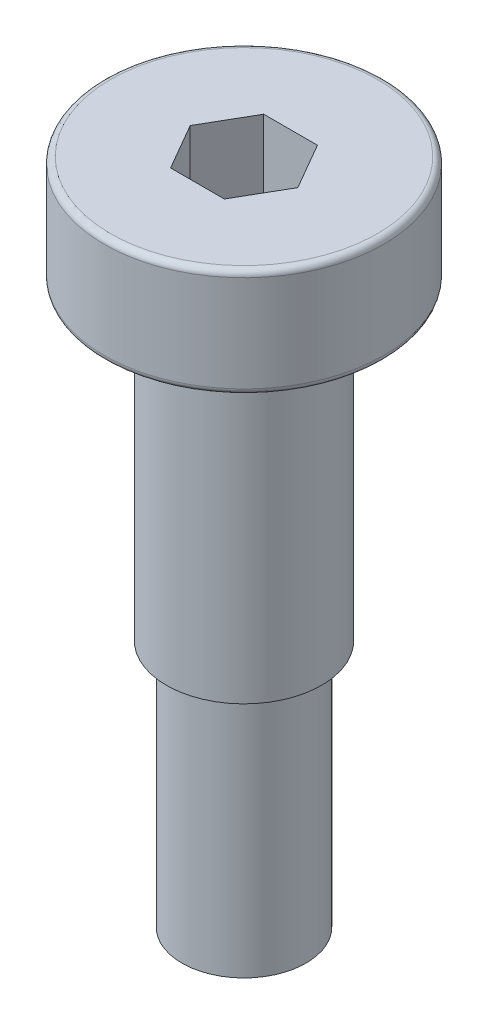
ISO-10303-21;
HEADER;
FILE_DESCRIPTION(('STEP AP214'),'2;1');
FILE_NAME('part.step','',(''),(''),'','','');
FILE_SCHEMA(('AUTOMOTIVE_DESIGN { 1 0 10303 214 1 1 1 1 }'));
ENDSEC;
DATA;
#1=APPLICATION_CONTEXT('core data for automotive mechanical design processes');
#2=APPLICATION_PROTOCOL_DEFINITION('international standard','automotive_design',2000,#1);
#3=PRODUCT_CONTEXT('',#1,'mechanical');
#4=PRODUCT('Part','Part','',(#3));
#5=PRODUCT_RELATED_PRODUCT_CATEGORY('part','',(#4));
#6=PRODUCT_DEFINITION_FORMATION('','',#4);
#7=PRODUCT_DEFINITION_CONTEXT('part definition',#1,'design');
#8=PRODUCT_DEFINITION('design','',#6,#7);
#9=PRODUCT_DEFINITION_SHAPE('','',#8);
#10=(LENGTH_UNIT() NAMED_UNIT(*) SI_UNIT(.MILLI.,.METRE.));
#11=(NAMED_UNIT(*) PLANE_ANGLE_UNIT() SI_UNIT($,.RADIAN.));
#12=(NAMED_UNIT(*) SI_UNIT($,.STERADIAN.) SOLID_ANGLE_UNIT());
#13=UNCERTAINTY_MEASURE_WITH_UNIT(LENGTH_MEASURE(1.E-05),#10,'distance_accuracy_value','');
#14=(GEOMETRIC_REPRESENTATION_CONTEXT(3) GLOBAL_UNCERTAINTY_ASSIGNED_CONTEXT((#13)) GLOBAL_UNIT_ASSIGNED_CONTEXT((#10,
#11,#12)) REPRESENTATION_CONTEXT('',''));
#15=CARTESIAN_POINT('',(0.,0.,0.));
#16=DIRECTION('',(0.,0.,1.));
#17=DIRECTION('',(1.,0.,0.));
#18=AXIS2_PLACEMENT_3D('',#15,#16,#17);
#19=CARTESIAN_POINT('',(0.,0.,0.));
#20=DIRECTION('',(0.,-1.,0.));
#21=DIRECTION('',(1.,0.,0.));
#22=AXIS2_PLACEMENT_3D('',#19,#20,#21);
#23=PLANE('',#22);
#24=CARTESIAN_POINT('',(0.,0.,0.));
#25=DIRECTION('',(0.,1.,0.));
#26=DIRECTION('',(-1.,0.,0.));
#27=AXIS2_PLACEMENT_3D('',#24,#25,#26);
#28=CIRCLE('',#27,2.);
#29=CARTESIAN_POINT('',(-2.,0.,0.));
#30=VERTEX_POINT('',#29);
#31=EDGE_CURVE('E133',#30,#30,#28,.T.);
#32=ORIENTED_EDGE('',*,*,#31,.F.);
#33=EDGE_LOOP('',(#32));
#34=FACE_BOUND('',#33,.T.);
#35=ADVANCED_FACE('F17',(#34),#23,.T.);
#36=CARTESIAN_POINT('',(0.,38.5685719297016,0.));
#37=DIRECTION('',(0.,1.,0.));
#38=DIRECTION('',(-1.,0.,0.));
#39=AXIS2_PLACEMENT_3D('',#36,#37,#38);
#40=CYLINDRICAL_SURFACE('',#39,2.);
#41=ORIENTED_EDGE('',*,*,#31,.T.);
#42=EDGE_LOOP('',(#41));
#43=FACE_BOUND('',#42,.T.);
#44=CARTESIAN_POINT('',(0.,8.,0.));
#45=DIRECTION('',(0.,1.,0.));
#46=DIRECTION('',(-1.,0.,0.));
#47=AXIS2_PLACEMENT_3D('',#44,#45,#46);
#48=CIRCLE('',#47,2.);
#49=CARTESIAN_POINT('',(-2.,8.,0.));
#50=VERTEX_POINT('',#49);
#51=EDGE_CURVE('E130',#50,#50,#48,.T.);
#52=ORIENTED_EDGE('',*,*,#51,.F.);
#53=EDGE_LOOP('',(#52));
#54=FACE_BOUND('',#53,.T.);
#55=ADVANCED_FACE('F174',(#43,#54),#40,.T.);
#56=CARTESIAN_POINT('',(-2.,8.,0.));
#57=DIRECTION('',(0.,-1.,0.));
#58=DIRECTION('',(1.,0.,0.));
#59=AXIS2_PLACEMENT_3D('',#56,#57,#58);
#60=PLANE('',#59);
#61=ORIENTED_EDGE('',*,*,#51,.T.);
#62=EDGE_LOOP('',(#61));
#63=FACE_BOUND('',#62,.T.);
#64=CARTESIAN_POINT('',(0.,8.,0.));
#65=DIRECTION('',(0.,1.,0.));
#66=DIRECTION('',(-1.,0.,0.));
#67=AXIS2_PLACEMENT_3D('',#64,#65,#66);
#68=CIRCLE('',#67,2.5);
#69=CARTESIAN_POINT('',(-2.5,8.,0.));
#70=VERTEX_POINT('',#69);
#71=EDGE_CURVE('E127',#70,#70,#68,.T.);
#72=ORIENTED_EDGE('',*,*,#71,.F.);
#73=EDGE_LOOP('',(#72));
#74=FACE_BOUND('',#73,.T.);
#75=ADVANCED_FACE('F181',(#63,#74),#60,.T.);
#76=CARTESIAN_POINT('',(0.,38.5685719297016,0.));
#77=DIRECTION('',(0.,1.,0.));
#78=DIRECTION('',(-1.,0.,0.));
#79=AXIS2_PLACEMENT_3D('',#76,#77,#78);
#80=CYLINDRICAL_SURFACE('',#79,2.5);
#81=ORIENTED_EDGE('',*,*,#71,.T.);
#82=EDGE_LOOP('',(#81));
#83=FACE_BOUND('',#82,.T.);
#84=CARTESIAN_POINT('',(0.,18.,0.));
#85=DIRECTION('',(0.,1.,0.));
#86=DIRECTION('',(-1.,0.,0.));
#87=AXIS2_PLACEMENT_3D('',#84,#85,#86);
#88=CIRCLE('',#87,2.5);
#89=CARTESIAN_POINT('',(-2.5,18.,0.));
#90=VERTEX_POINT('',#89);
#91=EDGE_CURVE('E119',#90,#90,#88,.T.);
#92=ORIENTED_EDGE('',*,*,#91,.F.);
#93=EDGE_LOOP('',(#92));
#94=FACE_BOUND('',#93,.T.);
#95=ADVANCED_FACE('F188',(#83,#94),#80,.T.);
#96=CARTESIAN_POINT('',(-2.5,18.,0.));
#97=DIRECTION('',(0.,-1.,0.));
#98=DIRECTION('',(1.,0.,0.));
#99=AXIS2_PLACEMENT_3D('',#96,#97,#98);
#100=PLANE('',#99);
#101=CARTESIAN_POINT('',(0.,18.,0.));
#102=DIRECTION('',(0.,-1.,0.));
#103=DIRECTION('',(1.,0.,0.));
#104=AXIS2_PLACEMENT_3D('',#101,#102,#103);
#105=CIRCLE('',#104,4.3);
#106=CARTESIAN_POINT('',(4.3,18.,0.));
#107=VERTEX_POINT('',#106);
#108=EDGE_CURVE('E11',#107,#107,#105,.T.);
#109=ORIENTED_EDGE('',*,*,#108,.T.);
#110=EDGE_LOOP('',(#109));
#111=FACE_BOUND('',#110,.T.);
#112=ORIENTED_EDGE('',*,*,#91,.T.);
#113=EDGE_LOOP('',(#112));
#114=FACE_BOUND('',#113,.T.);
#115=ADVANCED_FACE('F192',(#111,#114),#100,.T.);
#116=CARTESIAN_POINT('',(0.,38.5685719297016,0.));
#117=DIRECTION('',(0.,1.,0.));
#118=DIRECTION('',(-1.,0.,0.));
#119=AXIS2_PLACEMENT_3D('',#116,#117,#118);
#120=CYLINDRICAL_SURFACE('',#119,4.5);
#121=CARTESIAN_POINT('',(0.,21.3,0.));
#122=DIRECTION('',(0.,1.,0.));
#123=DIRECTION('',(-1.,0.,0.));
#124=AXIS2_PLACEMENT_3D('',#121,#122,#123);
#125=CIRCLE('',#124,4.5);
#126=CARTESIAN_POINT('',(-4.5,21.3,0.));
#127=VERTEX_POINT('',#126);
#128=EDGE_CURVE('E25',#127,#127,#125,.F.);
#129=ORIENTED_EDGE('',*,*,#128,.T.);
#130=EDGE_LOOP('',(#129));
#131=FACE_BOUND('',#130,.T.);
#132=CARTESIAN_POINT('',(0.,18.2,0.));
#133=DIRECTION('',(0.,-1.,0.));
#134=DIRECTION('',(1.,0.,0.));
#135=AXIS2_PLACEMENT_3D('',#132,#133,#134);
#136=CIRCLE('',#135,4.5);
#137=CARTESIAN_POINT('',(4.5,18.2,0.));
#138=VERTEX_POINT('',#137);
#139=EDGE_CURVE('E139',#138,#138,#136,.F.);
#140=ORIENTED_EDGE('',*,*,#139,.T.);
#141=EDGE_LOOP('',(#140));
#142=FACE_BOUND('',#141,.T.);
#143=ADVANCED_FACE('F144',(#131,#142),#120,.T.);
#144=CARTESIAN_POINT('',(-4.5,21.5,0.));
#145=DIRECTION('',(0.,1.,0.));
#146=DIRECTION('',(-1.,0.,0.));
#147=AXIS2_PLACEMENT_3D('',#144,#145,#146);
#148=PLANE('',#147);
#149=CARTESIAN_POINT('',(0.,21.5,0.));
#150=DIRECTION('',(0.,1.,0.));
#151=DIRECTION('',(-1.,0.,0.));
#152=AXIS2_PLACEMENT_3D('',#149,#150,#151);
#153=CIRCLE('',#152,4.3);
#154=CARTESIAN_POINT('',(-4.3,21.5,0.));
#155=VERTEX_POINT('',#154);
#156=EDGE_CURVE('E136',#155,#155,#153,.T.);
#157=ORIENTED_EDGE('',*,*,#156,.T.);
#158=EDGE_LOOP('',(#157));
#159=FACE_BOUND('',#158,.T.);
#160=DIRECTION('',(0.5,0.,-0.866025403784439));
#161=VECTOR('',#160,1.);
#162=CARTESIAN_POINT('',(0.866025403784437,21.5,1.5));
#163=LINE('',#162,#161);
#164=CARTESIAN_POINT('',(0.866025403784437,21.5,1.5));
#165=VERTEX_POINT('',#164);
#166=CARTESIAN_POINT('',(1.73205080756887,21.5,0.));
#167=VERTEX_POINT('',#166);
#168=EDGE_CURVE('E32',#165,#167,#163,.T.);
#169=ORIENTED_EDGE('',*,*,#168,.F.);
#170=DIRECTION('',(1.,0.,0.));
#171=VECTOR('',#170,1.);
#172=CARTESIAN_POINT('',(-0.866025403784441,21.5,1.5));
#173=LINE('',#172,#171);
#174=CARTESIAN_POINT('',(-0.866025403784441,21.5,1.5));
#175=VERTEX_POINT('',#174);
#176=EDGE_CURVE('E115',#175,#165,#173,.T.);
#177=ORIENTED_EDGE('',*,*,#176,.F.);
#178=DIRECTION('',(0.5,0.,0.866025403784439));
#179=VECTOR('',#178,1.);
#180=CARTESIAN_POINT('',(-1.73205080756888,21.5,0.));
#181=LINE('',#180,#179);
#182=CARTESIAN_POINT('',(-1.73205080756888,21.5,0.));
#183=VERTEX_POINT('',#182);
#184=EDGE_CURVE('E113',#183,#175,#181,.T.);
#185=ORIENTED_EDGE('',*,*,#184,.F.);
#186=DIRECTION('',(-0.5,0.,0.866025403784439));
#187=VECTOR('',#186,1.);
#188=CARTESIAN_POINT('',(-0.866025403784441,21.5,-1.5));
#189=LINE('',#188,#187);
#190=CARTESIAN_POINT('',(-0.866025403784441,21.5,-1.5));
#191=VERTEX_POINT('',#190);
#192=EDGE_CURVE('E80',#191,#183,#189,.T.);
#193=ORIENTED_EDGE('',*,*,#192,.F.);
#194=DIRECTION('',(-1.,0.,0.));
#195=VECTOR('',#194,1.);
#196=CARTESIAN_POINT('',(0.866025403784437,21.5,-1.5));
#197=LINE('',#196,#195);
#198=CARTESIAN_POINT('',(0.866025403784437,21.5,-1.5));
#199=VERTEX_POINT('',#198);
#200=EDGE_CURVE('E109',#199,#191,#197,.T.);
#201=ORIENTED_EDGE('',*,*,#200,.F.);
#202=DIRECTION('',(-0.5,0.,-0.866025403784439));
#203=VECTOR('',#202,1.);
#204=CARTESIAN_POINT('',(1.73205080756887,21.5,0.));
#205=LINE('',#204,#203);
#206=EDGE_CURVE('E106',#167,#199,#205,.T.);
#207=ORIENTED_EDGE('',*,*,#206,.F.);
#208=EDGE_LOOP('',(#169,#177,#185,#193,#201,#207));
#209=FACE_BOUND('',#208,.T.);
#210=ADVANCED_FACE('F152',(#159,#209),#148,.T.);
#211=CARTESIAN_POINT('',(0.866025403784437,18.5,1.5));
#212=DIRECTION('',(0.866025403784439,0.,0.5));
#213=DIRECTION('',(0.5,0.,-0.866025403784439));
#214=AXIS2_PLACEMENT_3D('',#211,#212,#213);
#215=PLANE('',#214);
#216=ORIENTED_EDGE('',*,*,#168,.T.);
#217=DIRECTION('',(0.,1.,0.));
#218=VECTOR('',#217,1.);
#219=CARTESIAN_POINT('',(1.73205080756887,18.5,0.));
#220=LINE('',#219,#218);
#221=CARTESIAN_POINT('',(1.73205080756887,18.5,0.));
#222=VERTEX_POINT('',#221);
#223=EDGE_CURVE('E62',#222,#167,#220,.T.);
#224=ORIENTED_EDGE('',*,*,#223,.F.);
#225=DIRECTION('',(0.5,0.,-0.866025403784439));
#226=VECTOR('',#225,1.);
#227=CARTESIAN_POINT('',(0.866025403784437,18.5,1.5));
#228=LINE('',#227,#226);
#229=CARTESIAN_POINT('',(0.866025403784437,18.5,1.5));
#230=VERTEX_POINT('',#229);
#231=EDGE_CURVE('E117',#230,#222,#228,.T.);
#232=ORIENTED_EDGE('',*,*,#231,.F.);
#233=DIRECTION('',(0.,1.,0.));
#234=VECTOR('',#233,1.);
#235=CARTESIAN_POINT('',(0.866025403784437,18.5,1.5));
#236=LINE('',#235,#234);
#237=EDGE_CURVE('E40',#230,#165,#236,.T.);
#238=ORIENTED_EDGE('',*,*,#237,.T.);
#239=EDGE_LOOP('',(#216,#224,#232,#238));
#240=FACE_BOUND('',#239,.T.);
#241=ADVANCED_FACE('F155',(#240),#215,.F.);
#242=CARTESIAN_POINT('',(-0.866025403784441,18.5,1.5));
#243=DIRECTION('',(0.,0.,1.));
#244=DIRECTION('',(1.,0.,0.));
#245=AXIS2_PLACEMENT_3D('',#242,#243,#244);
#246=PLANE('',#245);
#247=ORIENTED_EDGE('',*,*,#176,.T.);
#248=ORIENTED_EDGE('',*,*,#237,.F.);
#249=DIRECTION('',(1.,0.,0.));
#250=VECTOR('',#249,1.);
#251=CARTESIAN_POINT('',(-0.866025403784441,18.5,1.5));
#252=LINE('',#251,#250);
#253=CARTESIAN_POINT('',(-0.866025403784441,18.5,1.5));
#254=VERTEX_POINT('',#253);
#255=EDGE_CURVE('E92',#254,#230,#252,.T.);
#256=ORIENTED_EDGE('',*,*,#255,.F.);
#257=DIRECTION('',(0.,1.,0.));
#258=VECTOR('',#257,1.);
#259=CARTESIAN_POINT('',(-0.866025403784441,18.5,1.5));
#260=LINE('',#259,#258);
#261=EDGE_CURVE('E84',#254,#175,#260,.T.);
#262=ORIENTED_EDGE('',*,*,#261,.T.);
#263=EDGE_LOOP('',(#247,#248,#256,#262));
#264=FACE_BOUND('',#263,.T.);
#265=ADVANCED_FACE('F164',(#264),#246,.F.);
#266=CARTESIAN_POINT('',(-1.73205080756888,18.5,0.));
#267=DIRECTION('',(-0.866025403784439,0.,0.5));
#268=DIRECTION('',(0.5,0.,0.866025403784439));
#269=AXIS2_PLACEMENT_3D('',#266,#267,#268);
#270=PLANE('',#269);
#271=ORIENTED_EDGE('',*,*,#184,.T.);
#272=ORIENTED_EDGE('',*,*,#261,.F.);
#273=DIRECTION('',(0.5,0.,0.866025403784439));
#274=VECTOR('',#273,1.);
#275=CARTESIAN_POINT('',(-1.73205080756888,18.5,0.));
#276=LINE('',#275,#274);
#277=CARTESIAN_POINT('',(-1.73205080756888,18.5,0.));
#278=VERTEX_POINT('',#277);
#279=EDGE_CURVE('E88',#278,#254,#276,.T.);
#280=ORIENTED_EDGE('',*,*,#279,.F.);
#281=DIRECTION('',(0.,1.,0.));
#282=VECTOR('',#281,1.);
#283=CARTESIAN_POINT('',(-1.73205080756888,18.5,0.));
#284=LINE('',#283,#282);
#285=EDGE_CURVE('E73',#278,#183,#284,.T.);
#286=ORIENTED_EDGE('',*,*,#285,.T.);
#287=EDGE_LOOP('',(#271,#272,#280,#286));
#288=FACE_BOUND('',#287,.T.);
#289=ADVANCED_FACE('F89',(#288),#270,.F.);
#290=CARTESIAN_POINT('',(-0.866025403784441,18.5,-1.5));
#291=DIRECTION('',(-0.866025403784439,0.,-0.5));
#292=DIRECTION('',(-0.5,0.,0.866025403784439));
#293=AXIS2_PLACEMENT_3D('',#290,#291,#292);
#294=PLANE('',#293);
#295=ORIENTED_EDGE('',*,*,#192,.T.);
#296=ORIENTED_EDGE('',*,*,#285,.F.);
#297=DIRECTION('',(-0.5,0.,0.866025403784439));
#298=VECTOR('',#297,1.);
#299=CARTESIAN_POINT('',(-0.866025403784441,18.5,-1.5));
#300=LINE('',#299,#298);
#301=CARTESIAN_POINT('',(-0.866025403784441,18.5,-1.5));
#302=VERTEX_POINT('',#301);
#303=EDGE_CURVE('E77',#302,#278,#300,.T.);
#304=ORIENTED_EDGE('',*,*,#303,.F.);
#305=DIRECTION('',(0.,1.,0.));
#306=VECTOR('',#305,1.);
#307=CARTESIAN_POINT('',(-0.866025403784441,18.5,-1.5));
#308=LINE('',#307,#306);
#309=EDGE_CURVE('E85',#302,#191,#308,.T.);
#310=ORIENTED_EDGE('',*,*,#309,.T.);
#311=EDGE_LOOP('',(#295,#296,#304,#310));
#312=FACE_BOUND('',#311,.T.);
#313=ADVANCED_FACE('F75',(#312),#294,.F.);
#314=CARTESIAN_POINT('',(0.866025403784437,18.5,-1.5));
#315=DIRECTION('',(0.,0.,-1.));
#316=DIRECTION('',(-1.,0.,0.));
#317=AXIS2_PLACEMENT_3D('',#314,#315,#316);
#318=PLANE('',#317);
#319=ORIENTED_EDGE('',*,*,#200,.T.);
#320=ORIENTED_EDGE('',*,*,#309,.F.);
#321=DIRECTION('',(-1.,0.,0.));
#322=VECTOR('',#321,1.);
#323=CARTESIAN_POINT('',(0.866025403784437,18.5,-1.5));
#324=LINE('',#323,#322);
#325=CARTESIAN_POINT('',(0.866025403784437,18.5,-1.5));
#326=VERTEX_POINT('',#325);
#327=EDGE_CURVE('E98',#326,#302,#324,.T.);
#328=ORIENTED_EDGE('',*,*,#327,.F.);
#329=DIRECTION('',(0.,1.,0.));
#330=VECTOR('',#329,1.);
#331=CARTESIAN_POINT('',(0.866025403784437,18.5,-1.5));
#332=LINE('',#331,#330);
#333=EDGE_CURVE('E122',#326,#199,#332,.T.);
#334=ORIENTED_EDGE('',*,*,#333,.T.);
#335=EDGE_LOOP('',(#319,#320,#328,#334));
#336=FACE_BOUND('',#335,.T.);
#337=ADVANCED_FACE('F241',(#336),#318,.F.);
#338=CARTESIAN_POINT('',(1.73205080756887,18.5,0.));
#339=DIRECTION('',(0.866025403784438,0.,-0.5));
#340=DIRECTION('',(-0.5,0.,-0.866025403784439));
#341=AXIS2_PLACEMENT_3D('',#338,#339,#340);
#342=PLANE('',#341);
#343=ORIENTED_EDGE('',*,*,#206,.T.);
#344=ORIENTED_EDGE('',*,*,#333,.F.);
#345=DIRECTION('',(-0.5,0.,-0.866025403784439));
#346=VECTOR('',#345,1.);
#347=CARTESIAN_POINT('',(1.73205080756887,18.5,0.));
#348=LINE('',#347,#346);
#349=EDGE_CURVE('E100',#222,#326,#348,.T.);
#350=ORIENTED_EDGE('',*,*,#349,.F.);
#351=ORIENTED_EDGE('',*,*,#223,.T.);
#352=EDGE_LOOP('',(#343,#344,#350,#351));
#353=FACE_BOUND('',#352,.T.);
#354=ADVANCED_FACE('F161',(#353),#342,.F.);
#355=CARTESIAN_POINT('',(0.,18.5,0.));
#356=DIRECTION('',(0.,1.,0.));
#357=DIRECTION('',(0.,0.,1.));
#358=AXIS2_PLACEMENT_3D('',#355,#356,#357);
#359=PLANE('',#358);
#360=ORIENTED_EDGE('',*,*,#231,.T.);
#361=ORIENTED_EDGE('',*,*,#349,.T.);
#362=ORIENTED_EDGE('',*,*,#327,.T.);
#363=ORIENTED_EDGE('',*,*,#303,.T.);
#364=ORIENTED_EDGE('',*,*,#279,.T.);
#365=ORIENTED_EDGE('',*,*,#255,.T.);
#366=EDGE_LOOP('',(#360,#361,#362,#363,#364,#365));
#367=FACE_BOUND('',#366,.T.);
#368=ADVANCED_FACE('F95',(#367),#359,.T.);
#369=CARTESIAN_POINT('',(0.,21.3,0.));
#370=DIRECTION('',(0.,1.,0.));
#371=DIRECTION('',(-1.,0.,0.));
#372=AXIS2_PLACEMENT_3D('',#369,#370,#371);
#373=TOROIDAL_SURFACE('',#372,4.3,0.2);
#374=ORIENTED_EDGE('',*,*,#128,.F.);
#375=EDGE_LOOP('',(#374));
#376=FACE_BOUND('',#375,.T.);
#377=ORIENTED_EDGE('',*,*,#156,.F.);
#378=EDGE_LOOP('',(#377));
#379=FACE_BOUND('',#378,.T.);
#380=ADVANCED_FACE('F147',(#376,#379),#373,.T.);
#381=CARTESIAN_POINT('',(0.,18.2,0.));
#382=DIRECTION('',(0.,-1.,0.));
#383=DIRECTION('',(1.,0.,0.));
#384=AXIS2_PLACEMENT_3D('',#381,#382,#383);
#385=TOROIDAL_SURFACE('',#384,4.3,0.2);
#386=ORIENTED_EDGE('',*,*,#108,.F.);
#387=EDGE_LOOP('',(#386));
#388=FACE_BOUND('',#387,.T.);
#389=ORIENTED_EDGE('',*,*,#139,.F.);
#390=EDGE_LOOP('',(#389));
#391=FACE_BOUND('',#390,.T.);
#392=ADVANCED_FACE('F19',(#388,#391),#385,.T.);
#393=CLOSED_SHELL('',(#35,#55,#75,#95,#115,#143,#210,#241,#265,#289,#313,#337,#354,#368,#380,#392));
#394=MANIFOLD_SOLID_BREP('B1',#393);
#395=ADVANCED_BREP_SHAPE_REPRESENTATION('',(#18,#394),#14);
#396=SHAPE_DEFINITION_REPRESENTATION(#9,#395);
ENDSEC;
END-ISO-10303-21;
